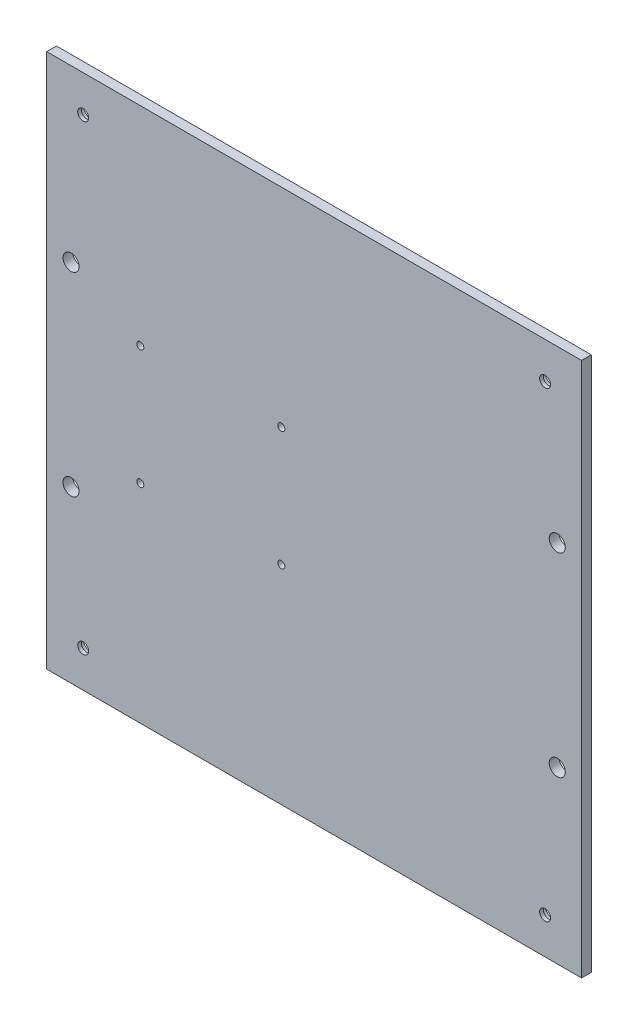
ISO-10303-21;
HEADER;
FILE_DESCRIPTION(('STEP AP214'),'2;1');
FILE_NAME('part.step','',(''),(''),'','','');
FILE_SCHEMA(('AUTOMOTIVE_DESIGN { 1 0 10303 214 1 1 1 1 }'));
ENDSEC;
DATA;
#1=APPLICATION_CONTEXT('core data for automotive mechanical design processes');
#2=APPLICATION_PROTOCOL_DEFINITION('international standard','automotive_design',2000,#1);
#3=PRODUCT_CONTEXT('',#1,'mechanical');
#4=PRODUCT('Part','Part','',(#3));
#5=PRODUCT_RELATED_PRODUCT_CATEGORY('part','',(#4));
#6=PRODUCT_DEFINITION_FORMATION('','',#4);
#7=PRODUCT_DEFINITION_CONTEXT('part definition',#1,'design');
#8=PRODUCT_DEFINITION('design','',#6,#7);
#9=PRODUCT_DEFINITION_SHAPE('','',#8);
#10=(LENGTH_UNIT() NAMED_UNIT(*) SI_UNIT(.MILLI.,.METRE.));
#11=(NAMED_UNIT(*) PLANE_ANGLE_UNIT() SI_UNIT($,.RADIAN.));
#12=(NAMED_UNIT(*) SI_UNIT($,.STERADIAN.) SOLID_ANGLE_UNIT());
#13=UNCERTAINTY_MEASURE_WITH_UNIT(LENGTH_MEASURE(1.E-05),#10,'distance_accuracy_value','');
#14=(GEOMETRIC_REPRESENTATION_CONTEXT(3) GLOBAL_UNCERTAINTY_ASSIGNED_CONTEXT((#13)) GLOBAL_UNIT_ASSIGNED_CONTEXT((#10,
#11,#12)) REPRESENTATION_CONTEXT('',''));
#15=CARTESIAN_POINT('',(0.,0.,0.));
#16=DIRECTION('',(0.,0.,1.));
#17=DIRECTION('',(1.,0.,0.));
#18=AXIS2_PLACEMENT_3D('',#15,#16,#17);
#19=CARTESIAN_POINT('',(110.,-110.,-50.));
#20=DIRECTION('',(-1.,0.,0.));
#21=DIRECTION('',(0.,0.,1.));
#22=AXIS2_PLACEMENT_3D('',#19,#20,#21);
#23=PLANE('',#22);
#24=DIRECTION('',(0.,1.,0.));
#25=VECTOR('',#24,1.);
#26=CARTESIAN_POINT('',(110.,-110.,-54.));
#27=LINE('',#26,#25);
#28=CARTESIAN_POINT('',(110.,-110.,-54.));
#29=VERTEX_POINT('',#28);
#30=CARTESIAN_POINT('',(110.,110.,-54.));
#31=VERTEX_POINT('',#30);
#32=EDGE_CURVE('E102',#29,#31,#27,.T.);
#33=ORIENTED_EDGE('',*,*,#32,.T.);
#34=DIRECTION('',(0.,0.,-1.));
#35=VECTOR('',#34,1.);
#36=CARTESIAN_POINT('',(110.,110.,-50.));
#37=LINE('',#36,#35);
#38=CARTESIAN_POINT('',(110.,110.,-50.));
#39=VERTEX_POINT('',#38);
#40=EDGE_CURVE('E11',#39,#31,#37,.T.);
#41=ORIENTED_EDGE('',*,*,#40,.F.);
#42=DIRECTION('',(0.,1.,0.));
#43=VECTOR('',#42,1.);
#44=CARTESIAN_POINT('',(110.,-110.,-50.));
#45=LINE('',#44,#43);
#46=CARTESIAN_POINT('',(110.,-110.,-50.));
#47=VERTEX_POINT('',#46);
#48=EDGE_CURVE('E92',#47,#39,#45,.T.);
#49=ORIENTED_EDGE('',*,*,#48,.F.);
#50=DIRECTION('',(0.,0.,-1.));
#51=VECTOR('',#50,1.);
#52=CARTESIAN_POINT('',(110.,-110.,-50.));
#53=LINE('',#52,#51);
#54=EDGE_CURVE('E103',#47,#29,#53,.T.);
#55=ORIENTED_EDGE('',*,*,#54,.T.);
#56=EDGE_LOOP('',(#33,#41,#49,#55));
#57=FACE_BOUND('',#56,.T.);
#58=ADVANCED_FACE('F39',(#57),#23,.F.);
#59=CARTESIAN_POINT('',(-110.,110.,-50.));
#60=DIRECTION('',(0.,-1.,0.));
#61=DIRECTION('',(0.,0.,-1.));
#62=AXIS2_PLACEMENT_3D('',#59,#60,#61);
#63=PLANE('',#62);
#64=DIRECTION('',(-1.,0.,0.));
#65=VECTOR('',#64,1.);
#66=CARTESIAN_POINT('',(-110.,110.,-54.));
#67=LINE('',#66,#65);
#68=CARTESIAN_POINT('',(-110.,110.,-54.));
#69=VERTEX_POINT('',#68);
#70=EDGE_CURVE('E98',#31,#69,#67,.T.);
#71=ORIENTED_EDGE('',*,*,#70,.T.);
#72=DIRECTION('',(0.,0.,-1.));
#73=VECTOR('',#72,1.);
#74=CARTESIAN_POINT('',(-110.,110.,-50.));
#75=LINE('',#74,#73);
#76=CARTESIAN_POINT('',(-110.,110.,-50.));
#77=VERTEX_POINT('',#76);
#78=EDGE_CURVE('E48',#77,#69,#75,.T.);
#79=ORIENTED_EDGE('',*,*,#78,.F.);
#80=DIRECTION('',(-1.,0.,0.));
#81=VECTOR('',#80,1.);
#82=CARTESIAN_POINT('',(-110.,110.,-50.));
#83=LINE('',#82,#81);
#84=EDGE_CURVE('E87',#39,#77,#83,.T.);
#85=ORIENTED_EDGE('',*,*,#84,.F.);
#86=ORIENTED_EDGE('',*,*,#40,.T.);
#87=EDGE_LOOP('',(#71,#79,#85,#86));
#88=FACE_BOUND('',#87,.T.);
#89=ADVANCED_FACE('F95',(#88),#63,.F.);
#90=CARTESIAN_POINT('',(-110.,-110.,-50.));
#91=DIRECTION('',(1.,0.,0.));
#92=DIRECTION('',(0.,0.,-1.));
#93=AXIS2_PLACEMENT_3D('',#90,#91,#92);
#94=PLANE('',#93);
#95=DIRECTION('',(0.,-1.,0.));
#96=VECTOR('',#95,1.);
#97=CARTESIAN_POINT('',(-110.,-110.,-54.));
#98=LINE('',#97,#96);
#99=CARTESIAN_POINT('',(-110.,-110.,-54.));
#100=VERTEX_POINT('',#99);
#101=EDGE_CURVE('E73',#69,#100,#98,.T.);
#102=ORIENTED_EDGE('',*,*,#101,.T.);
#103=DIRECTION('',(0.,0.,-1.));
#104=VECTOR('',#103,1.);
#105=CARTESIAN_POINT('',(-110.,-110.,-50.));
#106=LINE('',#105,#104);
#107=CARTESIAN_POINT('',(-110.,-110.,-50.));
#108=VERTEX_POINT('',#107);
#109=EDGE_CURVE('E97',#108,#100,#106,.T.);
#110=ORIENTED_EDGE('',*,*,#109,.F.);
#111=DIRECTION('',(0.,-1.,0.));
#112=VECTOR('',#111,1.);
#113=CARTESIAN_POINT('',(-110.,-110.,-50.));
#114=LINE('',#113,#112);
#115=EDGE_CURVE('E90',#77,#108,#114,.T.);
#116=ORIENTED_EDGE('',*,*,#115,.F.);
#117=ORIENTED_EDGE('',*,*,#78,.T.);
#118=EDGE_LOOP('',(#102,#110,#116,#117));
#119=FACE_BOUND('',#118,.T.);
#120=ADVANCED_FACE('F100',(#119),#94,.F.);
#121=CARTESIAN_POINT('',(-110.,-110.,-50.));
#122=DIRECTION('',(0.,1.,0.));
#123=DIRECTION('',(0.,0.,1.));
#124=AXIS2_PLACEMENT_3D('',#121,#122,#123);
#125=PLANE('',#124);
#126=DIRECTION('',(1.,0.,0.));
#127=VECTOR('',#126,1.);
#128=CARTESIAN_POINT('',(-110.,-110.,-54.));
#129=LINE('',#128,#127);
#130=EDGE_CURVE('E78',#100,#29,#129,.T.);
#131=ORIENTED_EDGE('',*,*,#130,.T.);
#132=ORIENTED_EDGE('',*,*,#54,.F.);
#133=DIRECTION('',(1.,0.,0.));
#134=VECTOR('',#133,1.);
#135=CARTESIAN_POINT('',(-110.,-110.,-50.));
#136=LINE('',#135,#134);
#137=EDGE_CURVE('E60',#108,#47,#136,.T.);
#138=ORIENTED_EDGE('',*,*,#137,.F.);
#139=ORIENTED_EDGE('',*,*,#109,.T.);
#140=EDGE_LOOP('',(#131,#132,#138,#139));
#141=FACE_BOUND('',#140,.T.);
#142=ADVANCED_FACE('F197',(#141),#125,.F.);
#143=CARTESIAN_POINT('',(0.,0.,-50.));
#144=DIRECTION('',(0.,0.,-1.));
#145=DIRECTION('',(-1.,0.,0.));
#146=AXIS2_PLACEMENT_3D('',#143,#144,#145);
#147=PLANE('',#146);
#148=CARTESIAN_POINT('',(-100.,40.,-50.));
#149=DIRECTION('',(0.,0.,1.));
#150=DIRECTION('',(1.,0.,0.));
#151=AXIS2_PLACEMENT_3D('',#148,#149,#150);
#152=CIRCLE('',#151,3.3);
#153=CARTESIAN_POINT('',(-96.7,40.,-50.));
#154=VERTEX_POINT('',#153);
#155=EDGE_CURVE('E487',#154,#154,#152,.T.);
#156=ORIENTED_EDGE('',*,*,#155,.F.);
#157=EDGE_LOOP('',(#156));
#158=FACE_BOUND('',#157,.T.);
#159=CARTESIAN_POINT('',(100.,-40.,-50.));
#160=DIRECTION('',(0.,0.,1.));
#161=DIRECTION('',(1.,0.,0.));
#162=AXIS2_PLACEMENT_3D('',#159,#160,#161);
#163=CIRCLE('',#162,3.3);
#164=CARTESIAN_POINT('',(103.3,-40.,-50.));
#165=VERTEX_POINT('',#164);
#166=EDGE_CURVE('E502',#165,#165,#163,.T.);
#167=ORIENTED_EDGE('',*,*,#166,.F.);
#168=EDGE_LOOP('',(#167));
#169=FACE_BOUND('',#168,.T.);
#170=CARTESIAN_POINT('',(100.,40.,-50.));
#171=DIRECTION('',(0.,0.,1.));
#172=DIRECTION('',(1.,0.,0.));
#173=AXIS2_PLACEMENT_3D('',#170,#171,#172);
#174=CIRCLE('',#173,3.3);
#175=CARTESIAN_POINT('',(103.3,40.,-50.));
#176=VERTEX_POINT('',#175);
#177=EDGE_CURVE('E497',#176,#176,#174,.T.);
#178=ORIENTED_EDGE('',*,*,#177,.F.);
#179=EDGE_LOOP('',(#178));
#180=FACE_BOUND('',#179,.T.);
#181=CARTESIAN_POINT('',(-100.,-40.,-50.));
#182=DIRECTION('',(0.,0.,1.));
#183=DIRECTION('',(1.,0.,0.));
#184=AXIS2_PLACEMENT_3D('',#181,#182,#183);
#185=CIRCLE('',#184,3.3);
#186=CARTESIAN_POINT('',(-96.7,-40.,-50.));
#187=VERTEX_POINT('',#186);
#188=EDGE_CURVE('E494',#187,#187,#185,.T.);
#189=ORIENTED_EDGE('',*,*,#188,.F.);
#190=EDGE_LOOP('',(#189));
#191=FACE_BOUND('',#190,.T.);
#192=CARTESIAN_POINT('',(-13.5,24.5,-50.));
#193=DIRECTION('',(0.,0.,1.));
#194=DIRECTION('',(1.,0.,0.));
#195=AXIS2_PLACEMENT_3D('',#192,#193,#194);
#196=CIRCLE('',#195,1.45);
#197=CARTESIAN_POINT('',(-12.05,24.5,-50.));
#198=VERTEX_POINT('',#197);
#199=EDGE_CURVE('E147',#198,#198,#196,.T.);
#200=ORIENTED_EDGE('',*,*,#199,.F.);
#201=EDGE_LOOP('',(#200));
#202=FACE_BOUND('',#201,.T.);
#203=CARTESIAN_POINT('',(-71.5,-24.5,-50.));
#204=DIRECTION('',(0.,0.,1.));
#205=DIRECTION('',(1.,0.,0.));
#206=AXIS2_PLACEMENT_3D('',#203,#204,#205);
#207=CIRCLE('',#206,1.45000000000001);
#208=CARTESIAN_POINT('',(-70.05,-24.5,-50.));
#209=VERTEX_POINT('',#208);
#210=EDGE_CURVE('E141',#209,#209,#207,.T.);
#211=ORIENTED_EDGE('',*,*,#210,.F.);
#212=EDGE_LOOP('',(#211));
#213=FACE_BOUND('',#212,.T.);
#214=CARTESIAN_POINT('',(-71.5,24.5,-50.));
#215=DIRECTION('',(0.,0.,1.));
#216=DIRECTION('',(1.,0.,0.));
#217=AXIS2_PLACEMENT_3D('',#214,#215,#216);
#218=CIRCLE('',#217,1.45000000000001);
#219=CARTESIAN_POINT('',(-70.05,24.5,-50.));
#220=VERTEX_POINT('',#219);
#221=EDGE_CURVE('E138',#220,#220,#218,.T.);
#222=ORIENTED_EDGE('',*,*,#221,.F.);
#223=EDGE_LOOP('',(#222));
#224=FACE_BOUND('',#223,.T.);
#225=CARTESIAN_POINT('',(-13.5,-24.5,-50.));
#226=DIRECTION('',(0.,0.,1.));
#227=DIRECTION('',(1.,0.,0.));
#228=AXIS2_PLACEMENT_3D('',#225,#226,#227);
#229=CIRCLE('',#228,1.45);
#230=CARTESIAN_POINT('',(-12.05,-24.5,-50.));
#231=VERTEX_POINT('',#230);
#232=EDGE_CURVE('E155',#231,#231,#229,.T.);
#233=ORIENTED_EDGE('',*,*,#232,.F.);
#234=EDGE_LOOP('',(#233));
#235=FACE_BOUND('',#234,.T.);
#236=CARTESIAN_POINT('',(-95.,95.,-50.));
#237=DIRECTION('',(0.,0.,1.));
#238=DIRECTION('',(1.,0.,0.));
#239=AXIS2_PLACEMENT_3D('',#236,#237,#238);
#240=CIRCLE('',#239,2.25);
#241=CARTESIAN_POINT('',(-92.75,95.,-50.));
#242=VERTEX_POINT('',#241);
#243=EDGE_CURVE('E184',#242,#242,#240,.T.);
#244=ORIENTED_EDGE('',*,*,#243,.F.);
#245=EDGE_LOOP('',(#244));
#246=FACE_BOUND('',#245,.T.);
#247=CARTESIAN_POINT('',(95.,-95.,-50.));
#248=DIRECTION('',(0.,0.,1.));
#249=DIRECTION('',(1.,0.,0.));
#250=AXIS2_PLACEMENT_3D('',#247,#248,#249);
#251=CIRCLE('',#250,2.25);
#252=CARTESIAN_POINT('',(97.25,-95.,-50.));
#253=VERTEX_POINT('',#252);
#254=EDGE_CURVE('E183',#253,#253,#251,.T.);
#255=ORIENTED_EDGE('',*,*,#254,.F.);
#256=EDGE_LOOP('',(#255));
#257=FACE_BOUND('',#256,.T.);
#258=CARTESIAN_POINT('',(95.,95.,-50.));
#259=DIRECTION('',(0.,0.,1.));
#260=DIRECTION('',(1.,0.,0.));
#261=AXIS2_PLACEMENT_3D('',#258,#259,#260);
#262=CIRCLE('',#261,2.25);
#263=CARTESIAN_POINT('',(97.25,95.,-50.));
#264=VERTEX_POINT('',#263);
#265=EDGE_CURVE('E130',#264,#264,#262,.T.);
#266=ORIENTED_EDGE('',*,*,#265,.F.);
#267=EDGE_LOOP('',(#266));
#268=FACE_BOUND('',#267,.T.);
#269=CARTESIAN_POINT('',(-95.,-95.,-50.));
#270=DIRECTION('',(0.,0.,1.));
#271=DIRECTION('',(1.,0.,0.));
#272=AXIS2_PLACEMENT_3D('',#269,#270,#271);
#273=CIRCLE('',#272,2.25);
#274=CARTESIAN_POINT('',(-92.75,-95.,-50.));
#275=VERTEX_POINT('',#274);
#276=EDGE_CURVE('E108',#275,#275,#273,.T.);
#277=ORIENTED_EDGE('',*,*,#276,.F.);
#278=EDGE_LOOP('',(#277));
#279=FACE_BOUND('',#278,.T.);
#280=ORIENTED_EDGE('',*,*,#48,.T.);
#281=ORIENTED_EDGE('',*,*,#84,.T.);
#282=ORIENTED_EDGE('',*,*,#115,.T.);
#283=ORIENTED_EDGE('',*,*,#137,.T.);
#284=EDGE_LOOP('',(#280,#281,#282,#283));
#285=FACE_BOUND('',#284,.T.);
#286=ADVANCED_FACE('F89',(#158,#169,#180,#191,#202,#213,#224,#235,#246,#257,#268,#279,#285),
#147,.F.);
#287=CARTESIAN_POINT('',(0.,0.,-54.));
#288=DIRECTION('',(0.,0.,-1.));
#289=DIRECTION('',(-1.,0.,0.));
#290=AXIS2_PLACEMENT_3D('',#287,#288,#289);
#291=PLANE('',#290);
#292=CARTESIAN_POINT('',(-100.,40.,-54.));
#293=DIRECTION('',(0.,0.,1.));
#294=DIRECTION('',(1.,0.,0.));
#295=AXIS2_PLACEMENT_3D('',#292,#293,#294);
#296=CIRCLE('',#295,3.3);
#297=CARTESIAN_POINT('',(-96.7,40.,-54.));
#298=VERTEX_POINT('',#297);
#299=EDGE_CURVE('E489',#298,#298,#296,.T.);
#300=ORIENTED_EDGE('',*,*,#299,.T.);
#301=EDGE_LOOP('',(#300));
#302=FACE_BOUND('',#301,.T.);
#303=CARTESIAN_POINT('',(100.,-40.,-54.));
#304=DIRECTION('',(0.,0.,1.));
#305=DIRECTION('',(1.,0.,0.));
#306=AXIS2_PLACEMENT_3D('',#303,#304,#305);
#307=CIRCLE('',#306,3.3);
#308=CARTESIAN_POINT('',(103.3,-40.,-54.));
#309=VERTEX_POINT('',#308);
#310=EDGE_CURVE('E496',#309,#309,#307,.T.);
#311=ORIENTED_EDGE('',*,*,#310,.T.);
#312=EDGE_LOOP('',(#311));
#313=FACE_BOUND('',#312,.T.);
#314=CARTESIAN_POINT('',(100.,40.,-54.));
#315=DIRECTION('',(0.,0.,1.));
#316=DIRECTION('',(1.,0.,0.));
#317=AXIS2_PLACEMENT_3D('',#314,#315,#316);
#318=CIRCLE('',#317,3.3);
#319=CARTESIAN_POINT('',(103.3,40.,-54.));
#320=VERTEX_POINT('',#319);
#321=EDGE_CURVE('E510',#320,#320,#318,.T.);
#322=ORIENTED_EDGE('',*,*,#321,.T.);
#323=EDGE_LOOP('',(#322));
#324=FACE_BOUND('',#323,.T.);
#325=CARTESIAN_POINT('',(-100.,-40.,-54.));
#326=DIRECTION('',(0.,0.,1.));
#327=DIRECTION('',(1.,0.,0.));
#328=AXIS2_PLACEMENT_3D('',#325,#326,#327);
#329=CIRCLE('',#328,3.3);
#330=CARTESIAN_POINT('',(-96.7,-40.,-54.));
#331=VERTEX_POINT('',#330);
#332=EDGE_CURVE('E493',#331,#331,#329,.T.);
#333=ORIENTED_EDGE('',*,*,#332,.T.);
#334=EDGE_LOOP('',(#333));
#335=FACE_BOUND('',#334,.T.);
#336=CARTESIAN_POINT('',(-13.5,24.5,-54.));
#337=DIRECTION('',(0.,0.,1.));
#338=DIRECTION('',(1.,0.,0.));
#339=AXIS2_PLACEMENT_3D('',#336,#337,#338);
#340=CIRCLE('',#339,2.5);
#341=CARTESIAN_POINT('',(-11.,24.5,-54.));
#342=VERTEX_POINT('',#341);
#343=EDGE_CURVE('E520',#342,#342,#340,.T.);
#344=ORIENTED_EDGE('',*,*,#343,.T.);
#345=EDGE_LOOP('',(#344));
#346=FACE_BOUND('',#345,.T.);
#347=CARTESIAN_POINT('',(-71.5,-24.5,-54.));
#348=DIRECTION('',(0.,0.,1.));
#349=DIRECTION('',(1.,0.,0.));
#350=AXIS2_PLACEMENT_3D('',#347,#348,#349);
#351=CIRCLE('',#350,2.5);
#352=CARTESIAN_POINT('',(-69.,-24.5,-54.));
#353=VERTEX_POINT('',#352);
#354=EDGE_CURVE('E524',#353,#353,#351,.T.);
#355=ORIENTED_EDGE('',*,*,#354,.T.);
#356=EDGE_LOOP('',(#355));
#357=FACE_BOUND('',#356,.T.);
#358=CARTESIAN_POINT('',(-71.5,24.5,-54.));
#359=DIRECTION('',(0.,0.,1.));
#360=DIRECTION('',(1.,0.,0.));
#361=AXIS2_PLACEMENT_3D('',#358,#359,#360);
#362=CIRCLE('',#361,2.5);
#363=CARTESIAN_POINT('',(-69.,24.5,-54.));
#364=VERTEX_POINT('',#363);
#365=EDGE_CURVE('E512',#364,#364,#362,.T.);
#366=ORIENTED_EDGE('',*,*,#365,.T.);
#367=EDGE_LOOP('',(#366));
#368=FACE_BOUND('',#367,.T.);
#369=CARTESIAN_POINT('',(-13.5,-24.5,-54.));
#370=DIRECTION('',(0.,0.,1.));
#371=DIRECTION('',(1.,0.,0.));
#372=AXIS2_PLACEMENT_3D('',#369,#370,#371);
#373=CIRCLE('',#372,2.5);
#374=CARTESIAN_POINT('',(-11.,-24.5,-54.));
#375=VERTEX_POINT('',#374);
#376=EDGE_CURVE('E152',#375,#375,#373,.T.);
#377=ORIENTED_EDGE('',*,*,#376,.T.);
#378=EDGE_LOOP('',(#377));
#379=FACE_BOUND('',#378,.T.);
#380=CARTESIAN_POINT('',(-95.,95.,-54.));
#381=DIRECTION('',(0.,0.,1.));
#382=DIRECTION('',(1.,0.,0.));
#383=AXIS2_PLACEMENT_3D('',#380,#381,#382);
#384=CIRCLE('',#383,4.2);
#385=CARTESIAN_POINT('',(-90.8,95.,-54.));
#386=VERTEX_POINT('',#385);
#387=EDGE_CURVE('E168',#386,#386,#384,.T.);
#388=ORIENTED_EDGE('',*,*,#387,.T.);
#389=EDGE_LOOP('',(#388));
#390=FACE_BOUND('',#389,.T.);
#391=CARTESIAN_POINT('',(95.,-95.,-54.));
#392=DIRECTION('',(0.,0.,1.));
#393=DIRECTION('',(1.,0.,0.));
#394=AXIS2_PLACEMENT_3D('',#391,#392,#393);
#395=CIRCLE('',#394,4.2);
#396=CARTESIAN_POINT('',(99.2,-95.,-54.));
#397=VERTEX_POINT('',#396);
#398=EDGE_CURVE('E173',#397,#397,#395,.T.);
#399=ORIENTED_EDGE('',*,*,#398,.T.);
#400=EDGE_LOOP('',(#399));
#401=FACE_BOUND('',#400,.T.);
#402=CARTESIAN_POINT('',(95.,95.,-54.));
#403=DIRECTION('',(0.,0.,1.));
#404=DIRECTION('',(1.,0.,0.));
#405=AXIS2_PLACEMENT_3D('',#402,#403,#404);
#406=CIRCLE('',#405,4.2);
#407=CARTESIAN_POINT('',(99.2,95.,-54.));
#408=VERTEX_POINT('',#407);
#409=EDGE_CURVE('E160',#408,#408,#406,.T.);
#410=ORIENTED_EDGE('',*,*,#409,.T.);
#411=EDGE_LOOP('',(#410));
#412=FACE_BOUND('',#411,.T.);
#413=CARTESIAN_POINT('',(-95.,-95.,-54.));
#414=DIRECTION('',(0.,0.,1.));
#415=DIRECTION('',(1.,0.,0.));
#416=AXIS2_PLACEMENT_3D('',#413,#414,#415);
#417=CIRCLE('',#416,4.2);
#418=CARTESIAN_POINT('',(-90.8,-95.,-54.));
#419=VERTEX_POINT('',#418);
#420=EDGE_CURVE('E169',#419,#419,#417,.T.);
#421=ORIENTED_EDGE('',*,*,#420,.T.);
#422=EDGE_LOOP('',(#421));
#423=FACE_BOUND('',#422,.T.);
#424=ORIENTED_EDGE('',*,*,#32,.F.);
#425=ORIENTED_EDGE('',*,*,#130,.F.);
#426=ORIENTED_EDGE('',*,*,#101,.F.);
#427=ORIENTED_EDGE('',*,*,#70,.F.);
#428=EDGE_LOOP('',(#424,#425,#426,#427));
#429=FACE_BOUND('',#428,.T.);
#430=ADVANCED_FACE('F196',(#302,#313,#324,#335,#346,#357,#368,#379,#390,#401,#412,#423,#429),
#291,.T.);
#431=CARTESIAN_POINT('',(-95.,-95.,-50.));
#432=DIRECTION('',(0.,0.,-1.));
#433=DIRECTION('',(-1.,0.,0.));
#434=AXIS2_PLACEMENT_3D('',#431,#432,#433);
#435=CYLINDRICAL_SURFACE('',#434,2.25);
#436=CARTESIAN_POINT('',(-95.,-95.,-51.5));
#437=DIRECTION('',(0.,0.,1.));
#438=DIRECTION('',(1.,0.,0.));
#439=AXIS2_PLACEMENT_3D('',#436,#437,#438);
#440=CIRCLE('',#439,2.25);
#441=CARTESIAN_POINT('',(-92.75,-95.,-51.5));
#442=VERTEX_POINT('',#441);
#443=EDGE_CURVE('E121',#442,#442,#440,.T.);
#444=ORIENTED_EDGE('',*,*,#443,.F.);
#445=EDGE_LOOP('',(#444));
#446=FACE_BOUND('',#445,.T.);
#447=ORIENTED_EDGE('',*,*,#276,.T.);
#448=EDGE_LOOP('',(#447));
#449=FACE_BOUND('',#448,.T.);
#450=ADVANCED_FACE('F192',(#446,#449),#435,.F.);
#451=CARTESIAN_POINT('',(95.,95.,-50.));
#452=DIRECTION('',(0.,0.,-1.));
#453=DIRECTION('',(-1.,0.,0.));
#454=AXIS2_PLACEMENT_3D('',#451,#452,#453);
#455=CYLINDRICAL_SURFACE('',#454,2.25);
#456=CARTESIAN_POINT('',(95.,95.,-51.5));
#457=DIRECTION('',(0.,0.,1.));
#458=DIRECTION('',(1.,0.,0.));
#459=AXIS2_PLACEMENT_3D('',#456,#457,#458);
#460=CIRCLE('',#459,2.25);
#461=CARTESIAN_POINT('',(97.25,95.,-51.5));
#462=VERTEX_POINT('',#461);
#463=EDGE_CURVE('E122',#462,#462,#460,.T.);
#464=ORIENTED_EDGE('',*,*,#463,.F.);
#465=EDGE_LOOP('',(#464));
#466=FACE_BOUND('',#465,.T.);
#467=ORIENTED_EDGE('',*,*,#265,.T.);
#468=EDGE_LOOP('',(#467));
#469=FACE_BOUND('',#468,.T.);
#470=ADVANCED_FACE('F236',(#466,#469),#455,.F.);
#471=CARTESIAN_POINT('',(95.,-95.,-50.));
#472=DIRECTION('',(0.,0.,-1.));
#473=DIRECTION('',(-1.,0.,0.));
#474=AXIS2_PLACEMENT_3D('',#471,#472,#473);
#475=CYLINDRICAL_SURFACE('',#474,2.25);
#476=CARTESIAN_POINT('',(95.,-95.,-51.5));
#477=DIRECTION('',(0.,0.,1.));
#478=DIRECTION('',(1.,0.,0.));
#479=AXIS2_PLACEMENT_3D('',#476,#477,#478);
#480=CIRCLE('',#479,2.25);
#481=CARTESIAN_POINT('',(97.25,-95.,-51.5));
#482=VERTEX_POINT('',#481);
#483=EDGE_CURVE('E120',#482,#482,#480,.T.);
#484=ORIENTED_EDGE('',*,*,#483,.F.);
#485=EDGE_LOOP('',(#484));
#486=FACE_BOUND('',#485,.T.);
#487=ORIENTED_EDGE('',*,*,#254,.T.);
#488=EDGE_LOOP('',(#487));
#489=FACE_BOUND('',#488,.T.);
#490=ADVANCED_FACE('F244',(#486,#489),#475,.F.);
#491=CARTESIAN_POINT('',(-95.,95.,-50.));
#492=DIRECTION('',(0.,0.,-1.));
#493=DIRECTION('',(-1.,0.,0.));
#494=AXIS2_PLACEMENT_3D('',#491,#492,#493);
#495=CYLINDRICAL_SURFACE('',#494,2.25);
#496=CARTESIAN_POINT('',(-95.,95.,-51.5));
#497=DIRECTION('',(0.,0.,1.));
#498=DIRECTION('',(1.,0.,0.));
#499=AXIS2_PLACEMENT_3D('',#496,#497,#498);
#500=CIRCLE('',#499,2.25);
#501=CARTESIAN_POINT('',(-92.75,95.,-51.5));
#502=VERTEX_POINT('',#501);
#503=EDGE_CURVE('E112',#502,#502,#500,.T.);
#504=ORIENTED_EDGE('',*,*,#503,.F.);
#505=EDGE_LOOP('',(#504));
#506=FACE_BOUND('',#505,.T.);
#507=ORIENTED_EDGE('',*,*,#243,.T.);
#508=EDGE_LOOP('',(#507));
#509=FACE_BOUND('',#508,.T.);
#510=ADVANCED_FACE('F251',(#506,#509),#495,.F.);
#511=CARTESIAN_POINT('',(-95.,95.,-51.5));
#512=DIRECTION('',(0.,0.,-1.));
#513=DIRECTION('',(-1.,0.,0.));
#514=AXIS2_PLACEMENT_3D('',#511,#512,#513);
#515=CYLINDRICAL_SURFACE('',#514,4.2);
#516=CARTESIAN_POINT('',(-95.,95.,-51.5));
#517=DIRECTION('',(0.,0.,1.));
#518=DIRECTION('',(1.,0.,0.));
#519=AXIS2_PLACEMENT_3D('',#516,#517,#518);
#520=CIRCLE('',#519,4.2);
#521=CARTESIAN_POINT('',(-90.8,95.,-51.5));
#522=VERTEX_POINT('',#521);
#523=EDGE_CURVE('E167',#522,#522,#520,.T.);
#524=ORIENTED_EDGE('',*,*,#523,.T.);
#525=EDGE_LOOP('',(#524));
#526=FACE_BOUND('',#525,.T.);
#527=ORIENTED_EDGE('',*,*,#387,.F.);
#528=EDGE_LOOP('',(#527));
#529=FACE_BOUND('',#528,.T.);
#530=ADVANCED_FACE('F264',(#526,#529),#515,.F.);
#531=CARTESIAN_POINT('',(-95.,95.,-51.5));
#532=DIRECTION('',(0.,0.,1.));
#533=DIRECTION('',(1.,0.,0.));
#534=AXIS2_PLACEMENT_3D('',#531,#532,#533);
#535=PLANE('',#534);
#536=ORIENTED_EDGE('',*,*,#503,.T.);
#537=EDGE_LOOP('',(#536));
#538=FACE_BOUND('',#537,.T.);
#539=ORIENTED_EDGE('',*,*,#523,.F.);
#540=EDGE_LOOP('',(#539));
#541=FACE_BOUND('',#540,.T.);
#542=ADVANCED_FACE('F275',(#538,#541),#535,.F.);
#543=CARTESIAN_POINT('',(95.,-95.,-51.5));
#544=DIRECTION('',(0.,0.,-1.));
#545=DIRECTION('',(-1.,0.,0.));
#546=AXIS2_PLACEMENT_3D('',#543,#544,#545);
#547=CYLINDRICAL_SURFACE('',#546,4.2);
#548=CARTESIAN_POINT('',(95.,-95.,-51.5));
#549=DIRECTION('',(0.,0.,1.));
#550=DIRECTION('',(1.,0.,0.));
#551=AXIS2_PLACEMENT_3D('',#548,#549,#550);
#552=CIRCLE('',#551,4.2);
#553=CARTESIAN_POINT('',(99.2,-95.,-51.5));
#554=VERTEX_POINT('',#553);
#555=EDGE_CURVE('E161',#554,#554,#552,.T.);
#556=ORIENTED_EDGE('',*,*,#555,.T.);
#557=EDGE_LOOP('',(#556));
#558=FACE_BOUND('',#557,.T.);
#559=ORIENTED_EDGE('',*,*,#398,.F.);
#560=EDGE_LOOP('',(#559));
#561=FACE_BOUND('',#560,.T.);
#562=ADVANCED_FACE('F281',(#558,#561),#547,.F.);
#563=CARTESIAN_POINT('',(95.,-95.,-51.5));
#564=DIRECTION('',(0.,0.,1.));
#565=DIRECTION('',(1.,0.,0.));
#566=AXIS2_PLACEMENT_3D('',#563,#564,#565);
#567=PLANE('',#566);
#568=ORIENTED_EDGE('',*,*,#483,.T.);
#569=EDGE_LOOP('',(#568));
#570=FACE_BOUND('',#569,.T.);
#571=ORIENTED_EDGE('',*,*,#555,.F.);
#572=EDGE_LOOP('',(#571));
#573=FACE_BOUND('',#572,.T.);
#574=ADVANCED_FACE('F290',(#570,#573),#567,.F.);
#575=CARTESIAN_POINT('',(95.,95.,-51.5));
#576=DIRECTION('',(0.,0.,-1.));
#577=DIRECTION('',(-1.,0.,0.));
#578=AXIS2_PLACEMENT_3D('',#575,#576,#577);
#579=CYLINDRICAL_SURFACE('',#578,4.2);
#580=CARTESIAN_POINT('',(95.,95.,-51.5));
#581=DIRECTION('',(0.,0.,1.));
#582=DIRECTION('',(1.,0.,0.));
#583=AXIS2_PLACEMENT_3D('',#580,#581,#582);
#584=CIRCLE('',#583,4.2);
#585=CARTESIAN_POINT('',(99.2,95.,-51.5));
#586=VERTEX_POINT('',#585);
#587=EDGE_CURVE('E158',#586,#586,#584,.T.);
#588=ORIENTED_EDGE('',*,*,#587,.T.);
#589=EDGE_LOOP('',(#588));
#590=FACE_BOUND('',#589,.T.);
#591=ORIENTED_EDGE('',*,*,#409,.F.);
#592=EDGE_LOOP('',(#591));
#593=FACE_BOUND('',#592,.T.);
#594=ADVANCED_FACE('F299',(#590,#593),#579,.F.);
#595=CARTESIAN_POINT('',(95.,95.,-51.5));
#596=DIRECTION('',(0.,0.,1.));
#597=DIRECTION('',(1.,0.,0.));
#598=AXIS2_PLACEMENT_3D('',#595,#596,#597);
#599=PLANE('',#598);
#600=ORIENTED_EDGE('',*,*,#463,.T.);
#601=EDGE_LOOP('',(#600));
#602=FACE_BOUND('',#601,.T.);
#603=ORIENTED_EDGE('',*,*,#587,.F.);
#604=EDGE_LOOP('',(#603));
#605=FACE_BOUND('',#604,.T.);
#606=ADVANCED_FACE('F308',(#602,#605),#599,.F.);
#607=CARTESIAN_POINT('',(-95.,-95.,-51.5));
#608=DIRECTION('',(0.,0.,-1.));
#609=DIRECTION('',(-1.,0.,0.));
#610=AXIS2_PLACEMENT_3D('',#607,#608,#609);
#611=CYLINDRICAL_SURFACE('',#610,4.2);
#612=CARTESIAN_POINT('',(-95.,-95.,-51.5));
#613=DIRECTION('',(0.,0.,1.));
#614=DIRECTION('',(1.,0.,0.));
#615=AXIS2_PLACEMENT_3D('',#612,#613,#614);
#616=CIRCLE('',#615,4.2);
#617=CARTESIAN_POINT('',(-90.8,-95.,-51.5));
#618=VERTEX_POINT('',#617);
#619=EDGE_CURVE('E117',#618,#618,#616,.T.);
#620=ORIENTED_EDGE('',*,*,#619,.T.);
#621=EDGE_LOOP('',(#620));
#622=FACE_BOUND('',#621,.T.);
#623=ORIENTED_EDGE('',*,*,#420,.F.);
#624=EDGE_LOOP('',(#623));
#625=FACE_BOUND('',#624,.T.);
#626=ADVANCED_FACE('F320',(#622,#625),#611,.F.);
#627=CARTESIAN_POINT('',(-95.,-95.,-51.5));
#628=DIRECTION('',(0.,0.,1.));
#629=DIRECTION('',(1.,0.,0.));
#630=AXIS2_PLACEMENT_3D('',#627,#628,#629);
#631=PLANE('',#630);
#632=ORIENTED_EDGE('',*,*,#443,.T.);
#633=EDGE_LOOP('',(#632));
#634=FACE_BOUND('',#633,.T.);
#635=ORIENTED_EDGE('',*,*,#619,.F.);
#636=EDGE_LOOP('',(#635));
#637=FACE_BOUND('',#636,.T.);
#638=ADVANCED_FACE('F326',(#634,#637),#631,.F.);
#639=CARTESIAN_POINT('',(-13.5,-24.5,-50.));
#640=DIRECTION('',(0.,0.,-1.));
#641=DIRECTION('',(-1.,0.,0.));
#642=AXIS2_PLACEMENT_3D('',#639,#640,#641);
#643=CYLINDRICAL_SURFACE('',#642,1.45);
#644=CARTESIAN_POINT('',(-13.5,-24.5,-52.5));
#645=DIRECTION('',(0.,0.,1.));
#646=DIRECTION('',(1.,0.,0.));
#647=AXIS2_PLACEMENT_3D('',#644,#645,#646);
#648=CIRCLE('',#647,1.45);
#649=CARTESIAN_POINT('',(-12.05,-24.5,-52.5));
#650=VERTEX_POINT('',#649);
#651=EDGE_CURVE('E45',#650,#650,#648,.T.);
#652=ORIENTED_EDGE('',*,*,#651,.F.);
#653=EDGE_LOOP('',(#652));
#654=FACE_BOUND('',#653,.T.);
#655=ORIENTED_EDGE('',*,*,#232,.T.);
#656=EDGE_LOOP('',(#655));
#657=FACE_BOUND('',#656,.T.);
#658=ADVANCED_FACE('F335',(#654,#657),#643,.F.);
#659=CARTESIAN_POINT('',(-71.5,24.5,-50.));
#660=DIRECTION('',(0.,0.,-1.));
#661=DIRECTION('',(-1.,0.,0.));
#662=AXIS2_PLACEMENT_3D('',#659,#660,#661);
#663=CYLINDRICAL_SURFACE('',#662,1.45000000000001);
#664=CARTESIAN_POINT('',(-71.5,24.5,-52.5));
#665=DIRECTION('',(0.,0.,1.));
#666=DIRECTION('',(1.,0.,0.));
#667=AXIS2_PLACEMENT_3D('',#664,#665,#666);
#668=CIRCLE('',#667,1.45000000000001);
#669=CARTESIAN_POINT('',(-70.05,24.5,-52.5));
#670=VERTEX_POINT('',#669);
#671=EDGE_CURVE('E133',#670,#670,#668,.T.);
#672=ORIENTED_EDGE('',*,*,#671,.F.);
#673=EDGE_LOOP('',(#672));
#674=FACE_BOUND('',#673,.T.);
#675=ORIENTED_EDGE('',*,*,#221,.T.);
#676=EDGE_LOOP('',(#675));
#677=FACE_BOUND('',#676,.T.);
#678=ADVANCED_FACE('F343',(#674,#677),#663,.F.);
#679=CARTESIAN_POINT('',(-71.5,-24.5,-50.));
#680=DIRECTION('',(0.,0.,-1.));
#681=DIRECTION('',(-1.,0.,0.));
#682=AXIS2_PLACEMENT_3D('',#679,#680,#681);
#683=CYLINDRICAL_SURFACE('',#682,1.45000000000001);
#684=CARTESIAN_POINT('',(-71.5,-24.5,-52.5));
#685=DIRECTION('',(0.,0.,1.));
#686=DIRECTION('',(1.,0.,0.));
#687=AXIS2_PLACEMENT_3D('',#684,#685,#686);
#688=CIRCLE('',#687,1.45000000000001);
#689=CARTESIAN_POINT('',(-70.05,-24.5,-52.5));
#690=VERTEX_POINT('',#689);
#691=EDGE_CURVE('E131',#690,#690,#688,.T.);
#692=ORIENTED_EDGE('',*,*,#691,.F.);
#693=EDGE_LOOP('',(#692));
#694=FACE_BOUND('',#693,.T.);
#695=ORIENTED_EDGE('',*,*,#210,.T.);
#696=EDGE_LOOP('',(#695));
#697=FACE_BOUND('',#696,.T.);
#698=ADVANCED_FACE('F354',(#694,#697),#683,.F.);
#699=CARTESIAN_POINT('',(-13.5,24.5,-50.));
#700=DIRECTION('',(0.,0.,-1.));
#701=DIRECTION('',(-1.,0.,0.));
#702=AXIS2_PLACEMENT_3D('',#699,#700,#701);
#703=CYLINDRICAL_SURFACE('',#702,1.45);
#704=CARTESIAN_POINT('',(-13.5,24.5,-52.5));
#705=DIRECTION('',(0.,0.,1.));
#706=DIRECTION('',(1.,0.,0.));
#707=AXIS2_PLACEMENT_3D('',#704,#705,#706);
#708=CIRCLE('',#707,1.45);
#709=CARTESIAN_POINT('',(-12.05,24.5,-52.5));
#710=VERTEX_POINT('',#709);
#711=EDGE_CURVE('E127',#710,#710,#708,.T.);
#712=ORIENTED_EDGE('',*,*,#711,.F.);
#713=EDGE_LOOP('',(#712));
#714=FACE_BOUND('',#713,.T.);
#715=ORIENTED_EDGE('',*,*,#199,.T.);
#716=EDGE_LOOP('',(#715));
#717=FACE_BOUND('',#716,.T.);
#718=ADVANCED_FACE('F365',(#714,#717),#703,.F.);
#719=CARTESIAN_POINT('',(-13.5,24.5,-52.5));
#720=DIRECTION('',(0.,0.,-1.));
#721=DIRECTION('',(-1.,0.,0.));
#722=AXIS2_PLACEMENT_3D('',#719,#720,#721);
#723=CYLINDRICAL_SURFACE('',#722,2.5);
#724=CARTESIAN_POINT('',(-13.5,24.5,-52.5));
#725=DIRECTION('',(0.,0.,1.));
#726=DIRECTION('',(1.,0.,0.));
#727=AXIS2_PLACEMENT_3D('',#724,#725,#726);
#728=CIRCLE('',#727,2.5);
#729=CARTESIAN_POINT('',(-11.,24.5,-52.5));
#730=VERTEX_POINT('',#729);
#731=EDGE_CURVE('E519',#730,#730,#728,.T.);
#732=ORIENTED_EDGE('',*,*,#731,.T.);
#733=EDGE_LOOP('',(#732));
#734=FACE_BOUND('',#733,.T.);
#735=ORIENTED_EDGE('',*,*,#343,.F.);
#736=EDGE_LOOP('',(#735));
#737=FACE_BOUND('',#736,.T.);
#738=ADVANCED_FACE('F371',(#734,#737),#723,.F.);
#739=CARTESIAN_POINT('',(-13.5,24.5,-52.5));
#740=DIRECTION('',(0.,0.,1.));
#741=DIRECTION('',(1.,0.,0.));
#742=AXIS2_PLACEMENT_3D('',#739,#740,#741);
#743=PLANE('',#742);
#744=ORIENTED_EDGE('',*,*,#711,.T.);
#745=EDGE_LOOP('',(#744));
#746=FACE_BOUND('',#745,.T.);
#747=ORIENTED_EDGE('',*,*,#731,.F.);
#748=EDGE_LOOP('',(#747));
#749=FACE_BOUND('',#748,.T.);
#750=ADVANCED_FACE('F379',(#746,#749),#743,.F.);
#751=CARTESIAN_POINT('',(-71.5,-24.5,-52.5));
#752=DIRECTION('',(0.,0.,-1.));
#753=DIRECTION('',(-1.,0.,0.));
#754=AXIS2_PLACEMENT_3D('',#751,#752,#753);
#755=CYLINDRICAL_SURFACE('',#754,2.5);
#756=CARTESIAN_POINT('',(-71.5,-24.5,-52.5));
#757=DIRECTION('',(0.,0.,1.));
#758=DIRECTION('',(1.,0.,0.));
#759=AXIS2_PLACEMENT_3D('',#756,#757,#758);
#760=CIRCLE('',#759,2.5);
#761=CARTESIAN_POINT('',(-69.,-24.5,-52.5));
#762=VERTEX_POINT('',#761);
#763=EDGE_CURVE('E511',#762,#762,#760,.T.);
#764=ORIENTED_EDGE('',*,*,#763,.T.);
#765=EDGE_LOOP('',(#764));
#766=FACE_BOUND('',#765,.T.);
#767=ORIENTED_EDGE('',*,*,#354,.F.);
#768=EDGE_LOOP('',(#767));
#769=FACE_BOUND('',#768,.T.);
#770=ADVANCED_FACE('F388',(#766,#769),#755,.F.);
#771=CARTESIAN_POINT('',(-71.5,-24.5,-52.5));
#772=DIRECTION('',(0.,0.,1.));
#773=DIRECTION('',(1.,0.,0.));
#774=AXIS2_PLACEMENT_3D('',#771,#772,#773);
#775=PLANE('',#774);
#776=ORIENTED_EDGE('',*,*,#691,.T.);
#777=EDGE_LOOP('',(#776));
#778=FACE_BOUND('',#777,.T.);
#779=ORIENTED_EDGE('',*,*,#763,.F.);
#780=EDGE_LOOP('',(#779));
#781=FACE_BOUND('',#780,.T.);
#782=ADVANCED_FACE('F399',(#778,#781),#775,.F.);
#783=CARTESIAN_POINT('',(-71.5,24.5,-52.5));
#784=DIRECTION('',(0.,0.,-1.));
#785=DIRECTION('',(-1.,0.,0.));
#786=AXIS2_PLACEMENT_3D('',#783,#784,#785);
#787=CYLINDRICAL_SURFACE('',#786,2.5);
#788=CARTESIAN_POINT('',(-71.5,24.5,-52.5));
#789=DIRECTION('',(0.,0.,1.));
#790=DIRECTION('',(1.,0.,0.));
#791=AXIS2_PLACEMENT_3D('',#788,#789,#790);
#792=CIRCLE('',#791,2.5);
#793=CARTESIAN_POINT('',(-69.,24.5,-52.5));
#794=VERTEX_POINT('',#793);
#795=EDGE_CURVE('E508',#794,#794,#792,.T.);
#796=ORIENTED_EDGE('',*,*,#795,.T.);
#797=EDGE_LOOP('',(#796));
#798=FACE_BOUND('',#797,.T.);
#799=ORIENTED_EDGE('',*,*,#365,.F.);
#800=EDGE_LOOP('',(#799));
#801=FACE_BOUND('',#800,.T.);
#802=ADVANCED_FACE('F410',(#798,#801),#787,.F.);
#803=CARTESIAN_POINT('',(-71.5,24.5,-52.5));
#804=DIRECTION('',(0.,0.,1.));
#805=DIRECTION('',(1.,0.,0.));
#806=AXIS2_PLACEMENT_3D('',#803,#804,#805);
#807=PLANE('',#806);
#808=ORIENTED_EDGE('',*,*,#671,.T.);
#809=EDGE_LOOP('',(#808));
#810=FACE_BOUND('',#809,.T.);
#811=ORIENTED_EDGE('',*,*,#795,.F.);
#812=EDGE_LOOP('',(#811));
#813=FACE_BOUND('',#812,.T.);
#814=ADVANCED_FACE('F416',(#810,#813),#807,.F.);
#815=CARTESIAN_POINT('',(-13.5,-24.5,-52.5));
#816=DIRECTION('',(0.,0.,-1.));
#817=DIRECTION('',(-1.,0.,0.));
#818=AXIS2_PLACEMENT_3D('',#815,#816,#817);
#819=CYLINDRICAL_SURFACE('',#818,2.5);
#820=CARTESIAN_POINT('',(-13.5,-24.5,-52.5));
#821=DIRECTION('',(0.,0.,1.));
#822=DIRECTION('',(1.,0.,0.));
#823=AXIS2_PLACEMENT_3D('',#820,#821,#822);
#824=CIRCLE('',#823,2.5);
#825=CARTESIAN_POINT('',(-11.,-24.5,-52.5));
#826=VERTEX_POINT('',#825);
#827=EDGE_CURVE('E132',#826,#826,#824,.T.);
#828=ORIENTED_EDGE('',*,*,#827,.T.);
#829=EDGE_LOOP('',(#828));
#830=FACE_BOUND('',#829,.T.);
#831=ORIENTED_EDGE('',*,*,#376,.F.);
#832=EDGE_LOOP('',(#831));
#833=FACE_BOUND('',#832,.T.);
#834=ADVANCED_FACE('F424',(#830,#833),#819,.F.);
#835=CARTESIAN_POINT('',(-13.5,-24.5,-52.5));
#836=DIRECTION('',(0.,0.,1.));
#837=DIRECTION('',(1.,0.,0.));
#838=AXIS2_PLACEMENT_3D('',#835,#836,#837);
#839=PLANE('',#838);
#840=ORIENTED_EDGE('',*,*,#651,.T.);
#841=EDGE_LOOP('',(#840));
#842=FACE_BOUND('',#841,.T.);
#843=ORIENTED_EDGE('',*,*,#827,.F.);
#844=EDGE_LOOP('',(#843));
#845=FACE_BOUND('',#844,.T.);
#846=ADVANCED_FACE('F435',(#842,#845),#839,.F.);
#847=CARTESIAN_POINT('',(-100.,-40.,-50.));
#848=DIRECTION('',(0.,0.,-1.));
#849=DIRECTION('',(-1.,0.,0.));
#850=AXIS2_PLACEMENT_3D('',#847,#848,#849);
#851=CYLINDRICAL_SURFACE('',#850,3.3);
#852=ORIENTED_EDGE('',*,*,#188,.T.);
#853=EDGE_LOOP('',(#852));
#854=FACE_BOUND('',#853,.T.);
#855=ORIENTED_EDGE('',*,*,#332,.F.);
#856=EDGE_LOOP('',(#855));
#857=FACE_BOUND('',#856,.T.);
#858=ADVANCED_FACE('F439',(#854,#857),#851,.F.);
#859=CARTESIAN_POINT('',(100.,40.,-50.));
#860=DIRECTION('',(0.,0.,-1.));
#861=DIRECTION('',(-1.,0.,0.));
#862=AXIS2_PLACEMENT_3D('',#859,#860,#861);
#863=CYLINDRICAL_SURFACE('',#862,3.3);
#864=ORIENTED_EDGE('',*,*,#177,.T.);
#865=EDGE_LOOP('',(#864));
#866=FACE_BOUND('',#865,.T.);
#867=ORIENTED_EDGE('',*,*,#321,.F.);
#868=EDGE_LOOP('',(#867));
#869=FACE_BOUND('',#868,.T.);
#870=ADVANCED_FACE('F455',(#866,#869),#863,.F.);
#871=CARTESIAN_POINT('',(100.,-40.,-50.));
#872=DIRECTION('',(0.,0.,-1.));
#873=DIRECTION('',(-1.,0.,0.));
#874=AXIS2_PLACEMENT_3D('',#871,#872,#873);
#875=CYLINDRICAL_SURFACE('',#874,3.3);
#876=ORIENTED_EDGE('',*,*,#166,.T.);
#877=EDGE_LOOP('',(#876));
#878=FACE_BOUND('',#877,.T.);
#879=ORIENTED_EDGE('',*,*,#310,.F.);
#880=EDGE_LOOP('',(#879));
#881=FACE_BOUND('',#880,.T.);
#882=ADVANCED_FACE('F462',(#878,#881),#875,.F.);
#883=CARTESIAN_POINT('',(-100.,40.,-50.));
#884=DIRECTION('',(0.,0.,-1.));
#885=DIRECTION('',(-1.,0.,0.));
#886=AXIS2_PLACEMENT_3D('',#883,#884,#885);
#887=CYLINDRICAL_SURFACE('',#886,3.3);
#888=ORIENTED_EDGE('',*,*,#155,.T.);
#889=EDGE_LOOP('',(#888));
#890=FACE_BOUND('',#889,.T.);
#891=ORIENTED_EDGE('',*,*,#299,.F.);
#892=EDGE_LOOP('',(#891));
#893=FACE_BOUND('',#892,.T.);
#894=ADVANCED_FACE('F475',(#890,#893),#887,.F.);
#895=CLOSED_SHELL('',(#58,#89,#120,#142,#286,#430,#450,#470,#490,#510,#530,#542,#562,#574,#594,
#606,#626,#638,#658,#678,#698,#718,#738,#750,#770,#782,#802,#814,#834,#846,#858,#870,#882,#894));
#896=MANIFOLD_SOLID_BREP('B2',#895);
#897=ADVANCED_BREP_SHAPE_REPRESENTATION('',(#18,#896),#14);
#898=SHAPE_DEFINITION_REPRESENTATION(#9,#897);
ENDSEC;
END-ISO-10303-21;
